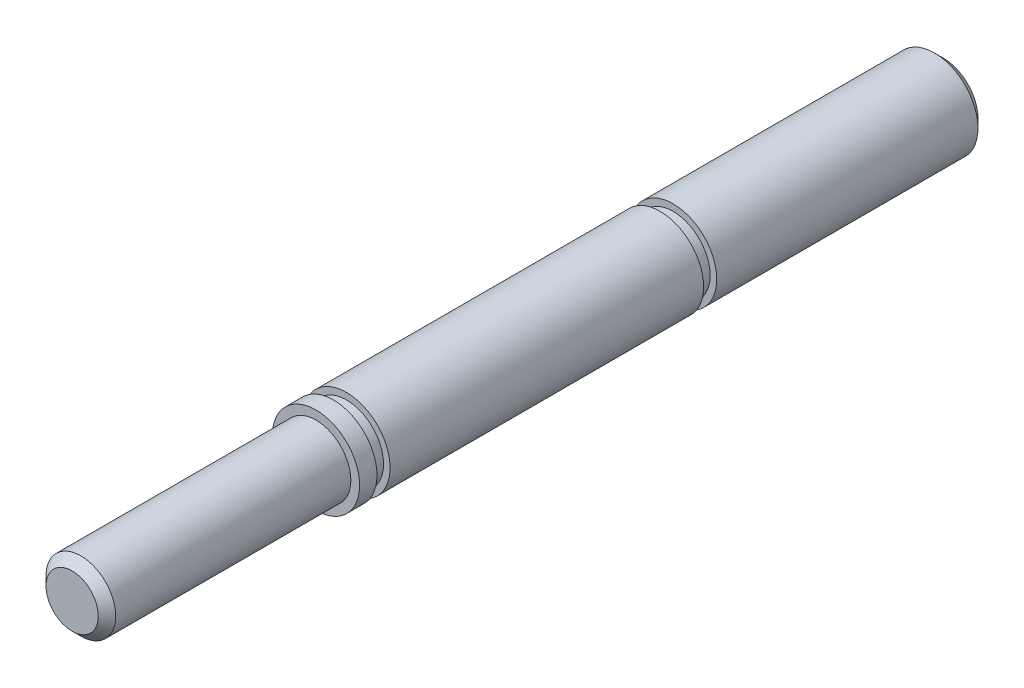
ISO-10303-21;
HEADER;
FILE_DESCRIPTION(('STEP AP214'),'2;1');
FILE_NAME('part.step','',(''),(''),'','','');
FILE_SCHEMA(('AUTOMOTIVE_DESIGN { 1 0 10303 214 1 1 1 1 }'));
ENDSEC;
DATA;
#1=APPLICATION_CONTEXT('core data for automotive mechanical design processes');
#2=APPLICATION_PROTOCOL_DEFINITION('international standard','automotive_design',2000,#1);
#3=PRODUCT_CONTEXT('',#1,'mechanical');
#4=PRODUCT('Part','Part','',(#3));
#5=PRODUCT_RELATED_PRODUCT_CATEGORY('part','',(#4));
#6=PRODUCT_DEFINITION_FORMATION('','',#4);
#7=PRODUCT_DEFINITION_CONTEXT('part definition',#1,'design');
#8=PRODUCT_DEFINITION('design','',#6,#7);
#9=PRODUCT_DEFINITION_SHAPE('','',#8);
#10=(LENGTH_UNIT() NAMED_UNIT(*) SI_UNIT(.MILLI.,.METRE.));
#11=(NAMED_UNIT(*) PLANE_ANGLE_UNIT() SI_UNIT($,.RADIAN.));
#12=(NAMED_UNIT(*) SI_UNIT($,.STERADIAN.) SOLID_ANGLE_UNIT());
#13=UNCERTAINTY_MEASURE_WITH_UNIT(LENGTH_MEASURE(1.E-05),#10,'distance_accuracy_value','');
#14=(GEOMETRIC_REPRESENTATION_CONTEXT(3) GLOBAL_UNCERTAINTY_ASSIGNED_CONTEXT((#13)) GLOBAL_UNIT_ASSIGNED_CONTEXT((#10,
#11,#12)) REPRESENTATION_CONTEXT('',''));
#15=CARTESIAN_POINT('',(0.,0.,0.));
#16=DIRECTION('',(0.,0.,1.));
#17=DIRECTION('',(1.,0.,0.));
#18=AXIS2_PLACEMENT_3D('',#15,#16,#17);
#19=CARTESIAN_POINT('',(0.,0.,50.));
#20=DIRECTION('',(0.,0.,-1.));
#21=DIRECTION('',(-1.,0.,0.));
#22=AXIS2_PLACEMENT_3D('',#19,#20,#21);
#23=CYLINDRICAL_SURFACE('',#22,5.);
#24=CARTESIAN_POINT('',(0.,0.,20.));
#25=DIRECTION('',(0.,0.,1.));
#26=DIRECTION('',(1.,0.,0.));
#27=AXIS2_PLACEMENT_3D('',#24,#25,#26);
#28=CIRCLE('',#27,5.);
#29=CARTESIAN_POINT('',(5.,0.,20.));
#30=VERTEX_POINT('',#29);
#31=EDGE_CURVE('E68',#30,#30,#28,.T.);
#32=ORIENTED_EDGE('',*,*,#31,.T.);
#33=EDGE_LOOP('',(#32));
#34=FACE_BOUND('',#33,.T.);
#35=CARTESIAN_POINT('',(0.,0.,22.));
#36=DIRECTION('',(0.,0.,1.));
#37=DIRECTION('',(1.,0.,0.));
#38=AXIS2_PLACEMENT_3D('',#35,#36,#37);
#39=CIRCLE('',#38,5.);
#40=CARTESIAN_POINT('',(5.,0.,22.));
#41=VERTEX_POINT('',#40);
#42=EDGE_CURVE('E54',#41,#41,#39,.T.);
#43=ORIENTED_EDGE('',*,*,#42,.F.);
#44=EDGE_LOOP('',(#43));
#45=FACE_BOUND('',#44,.T.);
#46=ADVANCED_FACE('F35',(#34,#45),#23,.T.);
#47=CARTESIAN_POINT('',(0.,0.,-19.));
#48=DIRECTION('',(0.,0.,-1.));
#49=DIRECTION('',(-1.,0.,0.));
#50=AXIS2_PLACEMENT_3D('',#47,#48,#49);
#51=CIRCLE('',#50,5.);
#52=CARTESIAN_POINT('',(-5.,0.,-19.));
#53=VERTEX_POINT('',#52);
#54=EDGE_CURVE('E59',#53,#53,#51,.T.);
#55=ORIENTED_EDGE('',*,*,#54,.T.);
#56=EDGE_LOOP('',(#55));
#57=FACE_BOUND('',#56,.T.);
#58=CARTESIAN_POINT('',(0.,0.,-49.));
#59=DIRECTION('',(0.,0.,1.));
#60=DIRECTION('',(1.,0.,0.));
#61=AXIS2_PLACEMENT_3D('',#58,#59,#60);
#62=CIRCLE('',#61,5.);
#63=CARTESIAN_POINT('',(5.,0.,-49.));
#64=VERTEX_POINT('',#63);
#65=EDGE_CURVE('E51',#64,#64,#62,.T.);
#66=ORIENTED_EDGE('',*,*,#65,.T.);
#67=EDGE_LOOP('',(#66));
#68=FACE_BOUND('',#67,.T.);
#69=ADVANCED_FACE('F97',(#57,#68),#23,.T.);
#70=CARTESIAN_POINT('',(0.,0.,-50.));
#71=DIRECTION('',(0.,0.,1.));
#72=DIRECTION('',(1.,0.,0.));
#73=AXIS2_PLACEMENT_3D('',#70,#71,#72);
#74=PLANE('',#73);
#75=CARTESIAN_POINT('',(0.,0.,-50.));
#76=DIRECTION('',(0.,0.,1.));
#77=DIRECTION('',(1.,0.,0.));
#78=AXIS2_PLACEMENT_3D('',#75,#76,#77);
#79=CIRCLE('',#78,4.);
#80=CARTESIAN_POINT('',(4.,0.,-50.));
#81=VERTEX_POINT('',#80);
#82=EDGE_CURVE('E47',#81,#81,#79,.F.);
#83=ORIENTED_EDGE('',*,*,#82,.T.);
#84=EDGE_LOOP('',(#83));
#85=FACE_BOUND('',#84,.T.);
#86=ADVANCED_FACE('F104',(#85),#74,.F.);
#87=CARTESIAN_POINT('',(0.,0.,-49.));
#88=DIRECTION('',(0.,0.,1.));
#89=DIRECTION('',(1.,0.,0.));
#90=AXIS2_PLACEMENT_3D('',#87,#88,#89);
#91=CONICAL_SURFACE('',#90,5.,0.785398163397453);
#92=ORIENTED_EDGE('',*,*,#82,.F.);
#93=EDGE_LOOP('',(#92));
#94=FACE_BOUND('',#93,.T.);
#95=ORIENTED_EDGE('',*,*,#65,.F.);
#96=EDGE_LOOP('',(#95));
#97=FACE_BOUND('',#96,.T.);
#98=ADVANCED_FACE('F133',(#94,#97),#91,.T.);
#99=CARTESIAN_POINT('',(4.25,0.,-19.));
#100=DIRECTION('',(0.,0.,-1.));
#101=DIRECTION('',(-1.,0.,0.));
#102=AXIS2_PLACEMENT_3D('',#99,#100,#101);
#103=PLANE('',#102);
#104=CARTESIAN_POINT('',(0.,0.,-19.));
#105=DIRECTION('',(0.,0.,1.));
#106=DIRECTION('',(1.,0.,0.));
#107=AXIS2_PLACEMENT_3D('',#104,#105,#106);
#108=CIRCLE('',#107,4.25);
#109=CARTESIAN_POINT('',(4.25,0.,-19.));
#110=VERTEX_POINT('',#109);
#111=EDGE_CURVE('E70',#110,#110,#108,.T.);
#112=ORIENTED_EDGE('',*,*,#111,.F.);
#113=EDGE_LOOP('',(#112));
#114=FACE_BOUND('',#113,.T.);
#115=ORIENTED_EDGE('',*,*,#54,.F.);
#116=EDGE_LOOP('',(#115));
#117=FACE_BOUND('',#116,.T.);
#118=ADVANCED_FACE('F127',(#114,#117),#103,.F.);
#119=CARTESIAN_POINT('',(4.25,0.,-17.5));
#120=DIRECTION('',(0.,0.,1.));
#121=DIRECTION('',(1.,0.,0.));
#122=AXIS2_PLACEMENT_3D('',#119,#120,#121);
#123=PLANE('',#122);
#124=CARTESIAN_POINT('',(0.,0.,-17.5));
#125=DIRECTION('',(0.,0.,1.));
#126=DIRECTION('',(1.,0.,0.));
#127=AXIS2_PLACEMENT_3D('',#124,#125,#126);
#128=CIRCLE('',#127,4.25);
#129=CARTESIAN_POINT('',(4.25,0.,-17.5));
#130=VERTEX_POINT('',#129);
#131=EDGE_CURVE('E77',#130,#130,#128,.T.);
#132=ORIENTED_EDGE('',*,*,#131,.T.);
#133=EDGE_LOOP('',(#132));
#134=FACE_BOUND('',#133,.T.);
#135=CARTESIAN_POINT('',(0.,0.,-17.5));
#136=DIRECTION('',(0.,0.,1.));
#137=DIRECTION('',(1.,0.,0.));
#138=AXIS2_PLACEMENT_3D('',#135,#136,#137);
#139=CIRCLE('',#138,5.);
#140=CARTESIAN_POINT('',(5.,0.,-17.5));
#141=VERTEX_POINT('',#140);
#142=EDGE_CURVE('E62',#141,#141,#139,.T.);
#143=ORIENTED_EDGE('',*,*,#142,.F.);
#144=EDGE_LOOP('',(#143));
#145=FACE_BOUND('',#144,.T.);
#146=ADVANCED_FACE('F118',(#134,#145),#123,.F.);
#147=CARTESIAN_POINT('',(0.,0.,0.));
#148=DIRECTION('',(0.,0.,1.));
#149=DIRECTION('',(1.,0.,0.));
#150=AXIS2_PLACEMENT_3D('',#147,#148,#149);
#151=CYLINDRICAL_SURFACE('',#150,4.25);
#152=ORIENTED_EDGE('',*,*,#131,.F.);
#153=EDGE_LOOP('',(#152));
#154=FACE_BOUND('',#153,.T.);
#155=ORIENTED_EDGE('',*,*,#111,.T.);
#156=EDGE_LOOP('',(#155));
#157=FACE_BOUND('',#156,.T.);
#158=ADVANCED_FACE('F109',(#154,#157),#151,.T.);
#159=ORIENTED_EDGE('',*,*,#142,.T.);
#160=EDGE_LOOP('',(#159));
#161=FACE_BOUND('',#160,.T.);
#162=CARTESIAN_POINT('',(0.,0.,18.5));
#163=DIRECTION('',(0.,0.,-1.));
#164=DIRECTION('',(-1.,0.,0.));
#165=AXIS2_PLACEMENT_3D('',#162,#163,#164);
#166=CIRCLE('',#165,5.);
#167=CARTESIAN_POINT('',(-5.,0.,18.5));
#168=VERTEX_POINT('',#167);
#169=EDGE_CURVE('E65',#168,#168,#166,.T.);
#170=ORIENTED_EDGE('',*,*,#169,.T.);
#171=EDGE_LOOP('',(#170));
#172=FACE_BOUND('',#171,.T.);
#173=ADVANCED_FACE('F100',(#161,#172),#23,.T.);
#174=CARTESIAN_POINT('',(4.25,0.,18.5));
#175=DIRECTION('',(0.,0.,-1.));
#176=DIRECTION('',(-1.,0.,0.));
#177=AXIS2_PLACEMENT_3D('',#174,#175,#176);
#178=PLANE('',#177);
#179=CARTESIAN_POINT('',(0.,0.,18.5));
#180=DIRECTION('',(0.,0.,1.));
#181=DIRECTION('',(1.,0.,0.));
#182=AXIS2_PLACEMENT_3D('',#179,#180,#181);
#183=CIRCLE('',#182,4.25);
#184=CARTESIAN_POINT('',(4.25,0.,18.5));
#185=VERTEX_POINT('',#184);
#186=EDGE_CURVE('E74',#185,#185,#183,.T.);
#187=ORIENTED_EDGE('',*,*,#186,.F.);
#188=EDGE_LOOP('',(#187));
#189=FACE_BOUND('',#188,.T.);
#190=ORIENTED_EDGE('',*,*,#169,.F.);
#191=EDGE_LOOP('',(#190));
#192=FACE_BOUND('',#191,.T.);
#193=ADVANCED_FACE('F108',(#189,#192),#178,.F.);
#194=CARTESIAN_POINT('',(4.25,0.,20.));
#195=DIRECTION('',(0.,0.,1.));
#196=DIRECTION('',(1.,0.,0.));
#197=AXIS2_PLACEMENT_3D('',#194,#195,#196);
#198=PLANE('',#197);
#199=CARTESIAN_POINT('',(0.,0.,20.));
#200=DIRECTION('',(0.,0.,1.));
#201=DIRECTION('',(1.,0.,0.));
#202=AXIS2_PLACEMENT_3D('',#199,#200,#201);
#203=CIRCLE('',#202,4.25);
#204=CARTESIAN_POINT('',(4.25,0.,20.));
#205=VERTEX_POINT('',#204);
#206=EDGE_CURVE('E57',#205,#205,#203,.T.);
#207=ORIENTED_EDGE('',*,*,#206,.T.);
#208=EDGE_LOOP('',(#207));
#209=FACE_BOUND('',#208,.T.);
#210=ORIENTED_EDGE('',*,*,#31,.F.);
#211=EDGE_LOOP('',(#210));
#212=FACE_BOUND('',#211,.T.);
#213=ADVANCED_FACE('F115',(#209,#212),#198,.F.);
#214=CARTESIAN_POINT('',(0.,0.,0.));
#215=DIRECTION('',(0.,0.,1.));
#216=DIRECTION('',(1.,0.,0.));
#217=AXIS2_PLACEMENT_3D('',#214,#215,#216);
#218=CYLINDRICAL_SURFACE('',#217,4.25);
#219=ORIENTED_EDGE('',*,*,#206,.F.);
#220=EDGE_LOOP('',(#219));
#221=FACE_BOUND('',#220,.T.);
#222=ORIENTED_EDGE('',*,*,#186,.T.);
#223=EDGE_LOOP('',(#222));
#224=FACE_BOUND('',#223,.T.);
#225=ADVANCED_FACE('F92',(#221,#224),#218,.T.);
#226=CARTESIAN_POINT('',(0.,0.,22.));
#227=DIRECTION('',(0.,0.,1.));
#228=DIRECTION('',(1.,0.,0.));
#229=AXIS2_PLACEMENT_3D('',#226,#227,#228);
#230=PLANE('',#229);
#231=CARTESIAN_POINT('',(0.,0.,22.));
#232=DIRECTION('',(0.,0.,1.));
#233=DIRECTION('',(1.,0.,0.));
#234=AXIS2_PLACEMENT_3D('',#231,#232,#233);
#235=CIRCLE('',#234,4.);
#236=CARTESIAN_POINT('',(4.,0.,22.));
#237=VERTEX_POINT('',#236);
#238=EDGE_CURVE('E58',#237,#237,#235,.T.);
#239=ORIENTED_EDGE('',*,*,#238,.F.);
#240=EDGE_LOOP('',(#239));
#241=FACE_BOUND('',#240,.T.);
#242=ORIENTED_EDGE('',*,*,#42,.T.);
#243=EDGE_LOOP('',(#242));
#244=FACE_BOUND('',#243,.T.);
#245=ADVANCED_FACE('F89',(#241,#244),#230,.T.);
#246=CARTESIAN_POINT('',(0.,0.,22.));
#247=DIRECTION('',(0.,0.,1.));
#248=DIRECTION('',(1.,0.,0.));
#249=AXIS2_PLACEMENT_3D('',#246,#247,#248);
#250=CYLINDRICAL_SURFACE('',#249,4.);
#251=CARTESIAN_POINT('',(0.,0.,49.));
#252=DIRECTION('',(0.,0.,1.));
#253=DIRECTION('',(1.,0.,0.));
#254=AXIS2_PLACEMENT_3D('',#251,#252,#253);
#255=CIRCLE('',#254,4.);
#256=CARTESIAN_POINT('',(4.,0.,49.));
#257=VERTEX_POINT('',#256);
#258=EDGE_CURVE('E11',#257,#257,#255,.F.);
#259=ORIENTED_EDGE('',*,*,#258,.T.);
#260=EDGE_LOOP('',(#259));
#261=FACE_BOUND('',#260,.T.);
#262=ORIENTED_EDGE('',*,*,#238,.T.);
#263=EDGE_LOOP('',(#262));
#264=FACE_BOUND('',#263,.T.);
#265=ADVANCED_FACE('F87',(#261,#264),#250,.T.);
#266=CARTESIAN_POINT('',(0.,0.,50.));
#267=DIRECTION('',(0.,0.,1.));
#268=DIRECTION('',(1.,0.,0.));
#269=AXIS2_PLACEMENT_3D('',#266,#267,#268);
#270=PLANE('',#269);
#271=CARTESIAN_POINT('',(0.,0.,50.));
#272=DIRECTION('',(0.,0.,1.));
#273=DIRECTION('',(1.,0.,0.));
#274=AXIS2_PLACEMENT_3D('',#271,#272,#273);
#275=CIRCLE('',#274,2.99999999999999);
#276=CARTESIAN_POINT('',(2.99999999999999,0.,50.));
#277=VERTEX_POINT('',#276);
#278=EDGE_CURVE('E43',#277,#277,#275,.T.);
#279=ORIENTED_EDGE('',*,*,#278,.T.);
#280=EDGE_LOOP('',(#279));
#281=FACE_BOUND('',#280,.T.);
#282=ADVANCED_FACE('F144',(#281),#270,.T.);
#283=CARTESIAN_POINT('',(0.,0.,50.));
#284=DIRECTION('',(0.,0.,-1.));
#285=DIRECTION('',(-1.,0.,0.));
#286=AXIS2_PLACEMENT_3D('',#283,#284,#285);
#287=CONICAL_SURFACE('',#286,2.99999999999999,0.78539816339744);
#288=ORIENTED_EDGE('',*,*,#258,.F.);
#289=EDGE_LOOP('',(#288));
#290=FACE_BOUND('',#289,.T.);
#291=ORIENTED_EDGE('',*,*,#278,.F.);
#292=EDGE_LOOP('',(#291));
#293=FACE_BOUND('',#292,.T.);
#294=ADVANCED_FACE('F38',(#290,#293),#287,.T.);
#295=CLOSED_SHELL('',(#46,#69,#86,#98,#118,#146,#158,#173,#193,#213,#225,#245,#265,#282,#294));
#296=MANIFOLD_SOLID_BREP('B2',#295);
#297=ADVANCED_BREP_SHAPE_REPRESENTATION('',(#18,#296),#14);
#298=SHAPE_DEFINITION_REPRESENTATION(#9,#297);
ENDSEC;
END-ISO-10303-21;
